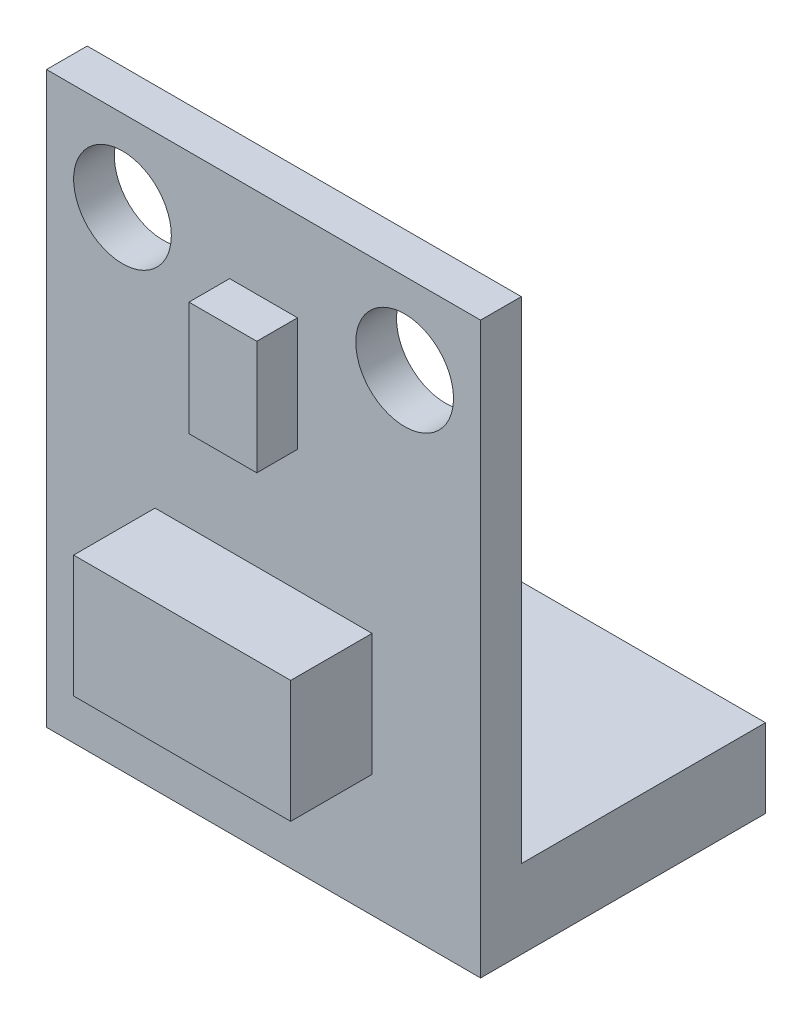
ISO-10303-21;
HEADER;
FILE_DESCRIPTION(('STEP AP214'),'2;1');
FILE_NAME('part.step','',(''),(''),'','','');
FILE_SCHEMA(('AUTOMOTIVE_DESIGN { 1 0 10303 214 1 1 1 1 }'));
ENDSEC;
DATA;
#1=APPLICATION_CONTEXT('core data for automotive mechanical design processes');
#2=APPLICATION_PROTOCOL_DEFINITION('international standard','automotive_design',2000,#1);
#3=PRODUCT_CONTEXT('',#1,'mechanical');
#4=PRODUCT('Part','Part','',(#3));
#5=PRODUCT_RELATED_PRODUCT_CATEGORY('part','',(#4));
#6=PRODUCT_DEFINITION_FORMATION('','',#4);
#7=PRODUCT_DEFINITION_CONTEXT('part definition',#1,'design');
#8=PRODUCT_DEFINITION('design','',#6,#7);
#9=PRODUCT_DEFINITION_SHAPE('','',#8);
#10=(LENGTH_UNIT() NAMED_UNIT(*) SI_UNIT(.MILLI.,.METRE.));
#11=(NAMED_UNIT(*) PLANE_ANGLE_UNIT() SI_UNIT($,.RADIAN.));
#12=(NAMED_UNIT(*) SI_UNIT($,.STERADIAN.) SOLID_ANGLE_UNIT());
#13=UNCERTAINTY_MEASURE_WITH_UNIT(LENGTH_MEASURE(1.E-05),#10,'distance_accuracy_value','');
#14=(GEOMETRIC_REPRESENTATION_CONTEXT(3) GLOBAL_UNCERTAINTY_ASSIGNED_CONTEXT((#13)) GLOBAL_UNIT_ASSIGNED_CONTEXT((#10,
#11,#12)) REPRESENTATION_CONTEXT('',''));
#15=CARTESIAN_POINT('',(0.,0.,0.));
#16=DIRECTION('',(0.,0.,1.));
#17=DIRECTION('',(1.,0.,0.));
#18=AXIS2_PLACEMENT_3D('',#15,#16,#17);
#19=CARTESIAN_POINT('',(0.,0.,0.));
#20=DIRECTION('',(0.,0.,1.));
#21=DIRECTION('',(1.,0.,0.));
#22=AXIS2_PLACEMENT_3D('',#19,#20,#21);
#23=PLANE('',#22);
#24=CARTESIAN_POINT('',(5.2,7.5,0.));
#25=DIRECTION('',(0.,0.,1.));
#26=DIRECTION('',(-1.,0.,0.));
#27=AXIS2_PLACEMENT_3D('',#24,#25,#26);
#28=CIRCLE('',#27,1.8);
#29=CARTESIAN_POINT('',(3.4,7.5,0.));
#30=VERTEX_POINT('',#29);
#31=EDGE_CURVE('E240',#30,#30,#28,.T.);
#32=ORIENTED_EDGE('',*,*,#31,.T.);
#33=EDGE_LOOP('',(#32));
#34=FACE_BOUND('',#33,.T.);
#35=CARTESIAN_POINT('',(-5.2,7.5,0.));
#36=DIRECTION('',(0.,0.,1.));
#37=DIRECTION('',(1.,0.,0.));
#38=AXIS2_PLACEMENT_3D('',#35,#36,#37);
#39=CIRCLE('',#38,1.8);
#40=CARTESIAN_POINT('',(-3.4,7.5,0.));
#41=VERTEX_POINT('',#40);
#42=EDGE_CURVE('E244',#41,#41,#39,.T.);
#43=ORIENTED_EDGE('',*,*,#42,.T.);
#44=EDGE_LOOP('',(#43));
#45=FACE_BOUND('',#44,.T.);
#46=DIRECTION('',(1.,0.,0.));
#47=VECTOR('',#46,1.);
#48=CARTESIAN_POINT('',(8.,-7.6,0.));
#49=LINE('',#48,#47);
#50=CARTESIAN_POINT('',(-8.,-7.6,0.));
#51=VERTEX_POINT('',#50);
#52=CARTESIAN_POINT('',(8.,-7.6,0.));
#53=VERTEX_POINT('',#52);
#54=EDGE_CURVE('E60',#51,#53,#49,.T.);
#55=ORIENTED_EDGE('',*,*,#54,.F.);
#56=DIRECTION('',(0.,-1.,0.));
#57=VECTOR('',#56,1.);
#58=CARTESIAN_POINT('',(-8.,10.5,0.));
#59=LINE('',#58,#57);
#60=CARTESIAN_POINT('',(-8.,10.5,0.));
#61=VERTEX_POINT('',#60);
#62=EDGE_CURVE('E255',#61,#51,#59,.T.);
#63=ORIENTED_EDGE('',*,*,#62,.F.);
#64=DIRECTION('',(-1.,0.,0.));
#65=VECTOR('',#64,1.);
#66=CARTESIAN_POINT('',(-8.,10.5,0.));
#67=LINE('',#66,#65);
#68=CARTESIAN_POINT('',(8.,10.5,0.));
#69=VERTEX_POINT('',#68);
#70=EDGE_CURVE('E261',#69,#61,#67,.T.);
#71=ORIENTED_EDGE('',*,*,#70,.F.);
#72=DIRECTION('',(0.,1.,0.));
#73=VECTOR('',#72,1.);
#74=CARTESIAN_POINT('',(8.,10.5,0.));
#75=LINE('',#74,#73);
#76=EDGE_CURVE('E250',#53,#69,#75,.T.);
#77=ORIENTED_EDGE('',*,*,#76,.F.);
#78=EDGE_LOOP('',(#55,#63,#71,#77));
#79=FACE_BOUND('',#78,.T.);
#80=ADVANCED_FACE('F45',(#34,#45,#79),#23,.F.);
#81=CARTESIAN_POINT('',(0.,0.,1.5));
#82=DIRECTION('',(0.,0.,1.));
#83=DIRECTION('',(1.,0.,0.));
#84=AXIS2_PLACEMENT_3D('',#81,#82,#83);
#85=PLANE('',#84);
#86=CARTESIAN_POINT('',(-5.2,7.5,1.5));
#87=DIRECTION('',(0.,0.,1.));
#88=DIRECTION('',(1.,0.,0.));
#89=AXIS2_PLACEMENT_3D('',#86,#87,#88);
#90=CIRCLE('',#89,1.8);
#91=CARTESIAN_POINT('',(-3.4,7.5,1.5));
#92=VERTEX_POINT('',#91);
#93=EDGE_CURVE('E247',#92,#92,#90,.T.);
#94=ORIENTED_EDGE('',*,*,#93,.F.);
#95=EDGE_LOOP('',(#94));
#96=FACE_BOUND('',#95,.T.);
#97=DIRECTION('',(0.,1.,0.));
#98=VECTOR('',#97,1.);
#99=CARTESIAN_POINT('',(8.,10.5,1.5));
#100=LINE('',#99,#98);
#101=CARTESIAN_POINT('',(8.,-10.5,1.5));
#102=VERTEX_POINT('',#101);
#103=CARTESIAN_POINT('',(8.,10.5,1.5));
#104=VERTEX_POINT('',#103);
#105=EDGE_CURVE('E156',#102,#104,#100,.T.);
#106=ORIENTED_EDGE('',*,*,#105,.T.);
#107=DIRECTION('',(-1.,0.,0.));
#108=VECTOR('',#107,1.);
#109=CARTESIAN_POINT('',(-8.,10.5,1.5));
#110=LINE('',#109,#108);
#111=CARTESIAN_POINT('',(-8.,10.5,1.5));
#112=VERTEX_POINT('',#111);
#113=EDGE_CURVE('E254',#104,#112,#110,.T.);
#114=ORIENTED_EDGE('',*,*,#113,.T.);
#115=DIRECTION('',(0.,-1.,0.));
#116=VECTOR('',#115,1.);
#117=CARTESIAN_POINT('',(-8.,10.5,1.5));
#118=LINE('',#117,#116);
#119=CARTESIAN_POINT('',(-8.,-10.5,1.5));
#120=VERTEX_POINT('',#119);
#121=EDGE_CURVE('E257',#112,#120,#118,.T.);
#122=ORIENTED_EDGE('',*,*,#121,.T.);
#123=DIRECTION('',(1.,0.,0.));
#124=VECTOR('',#123,1.);
#125=CARTESIAN_POINT('',(-8.,-10.5,1.5));
#126=LINE('',#125,#124);
#127=EDGE_CURVE('E160',#120,#102,#126,.T.);
#128=ORIENTED_EDGE('',*,*,#127,.T.);
#129=EDGE_LOOP('',(#106,#114,#122,#128));
#130=FACE_BOUND('',#129,.T.);
#131=CARTESIAN_POINT('',(5.2,7.5,1.5));
#132=DIRECTION('',(0.,0.,1.));
#133=DIRECTION('',(-1.,0.,0.));
#134=AXIS2_PLACEMENT_3D('',#131,#132,#133);
#135=CIRCLE('',#134,1.8);
#136=CARTESIAN_POINT('',(3.4,7.5,1.5));
#137=VERTEX_POINT('',#136);
#138=EDGE_CURVE('E241',#137,#137,#135,.T.);
#139=ORIENTED_EDGE('',*,*,#138,.F.);
#140=EDGE_LOOP('',(#139));
#141=FACE_BOUND('',#140,.T.);
#142=DIRECTION('',(-1.,0.,0.));
#143=VECTOR('',#142,1.);
#144=CARTESIAN_POINT('',(-1.25,7.2,1.5));
#145=LINE('',#144,#143);
#146=CARTESIAN_POINT('',(1.25,7.2,1.5));
#147=VERTEX_POINT('',#146);
#148=CARTESIAN_POINT('',(-1.25,7.2,1.5));
#149=VERTEX_POINT('',#148);
#150=EDGE_CURVE('E225',#147,#149,#145,.T.);
#151=ORIENTED_EDGE('',*,*,#150,.F.);
#152=DIRECTION('',(0.,1.,0.));
#153=VECTOR('',#152,1.);
#154=CARTESIAN_POINT('',(1.25,7.2,1.5));
#155=LINE('',#154,#153);
#156=CARTESIAN_POINT('',(1.25,3.,1.5));
#157=VERTEX_POINT('',#156);
#158=EDGE_CURVE('E211',#157,#147,#155,.T.);
#159=ORIENTED_EDGE('',*,*,#158,.F.);
#160=DIRECTION('',(1.,0.,0.));
#161=VECTOR('',#160,1.);
#162=CARTESIAN_POINT('',(-1.25,3.,1.5));
#163=LINE('',#162,#161);
#164=CARTESIAN_POINT('',(-1.25,3.,1.5));
#165=VERTEX_POINT('',#164);
#166=EDGE_CURVE('E216',#165,#157,#163,.T.);
#167=ORIENTED_EDGE('',*,*,#166,.F.);
#168=DIRECTION('',(0.,-1.,0.));
#169=VECTOR('',#168,1.);
#170=CARTESIAN_POINT('',(-1.25,7.2,1.5));
#171=LINE('',#170,#169);
#172=EDGE_CURVE('E227',#149,#165,#171,.T.);
#173=ORIENTED_EDGE('',*,*,#172,.F.);
#174=EDGE_LOOP('',(#151,#159,#167,#173));
#175=FACE_BOUND('',#174,.T.);
#176=DIRECTION('',(-1.,0.,0.));
#177=VECTOR('',#176,1.);
#178=CARTESIAN_POINT('',(-4.,-1.5,1.5));
#179=LINE('',#178,#177);
#180=CARTESIAN_POINT('',(4.,-1.5,1.5));
#181=VERTEX_POINT('',#180);
#182=CARTESIAN_POINT('',(-4.,-1.5,1.5));
#183=VERTEX_POINT('',#182);
#184=EDGE_CURVE('E198',#181,#183,#179,.T.);
#185=ORIENTED_EDGE('',*,*,#184,.F.);
#186=DIRECTION('',(0.,1.,0.));
#187=VECTOR('',#186,1.);
#188=CARTESIAN_POINT('',(4.,-1.5,1.5));
#189=LINE('',#188,#187);
#190=CARTESIAN_POINT('',(4.,-6.,1.5));
#191=VERTEX_POINT('',#190);
#192=EDGE_CURVE('E184',#191,#181,#189,.T.);
#193=ORIENTED_EDGE('',*,*,#192,.F.);
#194=DIRECTION('',(1.,0.,0.));
#195=VECTOR('',#194,1.);
#196=CARTESIAN_POINT('',(-4.,-6.,1.5));
#197=LINE('',#196,#195);
#198=CARTESIAN_POINT('',(-4.,-6.,1.5));
#199=VERTEX_POINT('',#198);
#200=EDGE_CURVE('E189',#199,#191,#197,.T.);
#201=ORIENTED_EDGE('',*,*,#200,.F.);
#202=DIRECTION('',(0.,-1.,0.));
#203=VECTOR('',#202,1.);
#204=CARTESIAN_POINT('',(-4.,-1.5,1.5));
#205=LINE('',#204,#203);
#206=EDGE_CURVE('E200',#183,#199,#205,.T.);
#207=ORIENTED_EDGE('',*,*,#206,.F.);
#208=EDGE_LOOP('',(#185,#193,#201,#207));
#209=FACE_BOUND('',#208,.T.);
#210=ADVANCED_FACE('F276',(#96,#130,#141,#175,#209),#85,.T.);
#211=CARTESIAN_POINT('',(8.,10.5,1.5));
#212=DIRECTION('',(-1.,0.,0.));
#213=DIRECTION('',(0.,-1.,0.));
#214=AXIS2_PLACEMENT_3D('',#211,#212,#213);
#215=PLANE('',#214);
#216=DIRECTION('',(0.,0.,-1.));
#217=VECTOR('',#216,1.);
#218=CARTESIAN_POINT('',(8.,-10.5,1.5));
#219=LINE('',#218,#217);
#220=CARTESIAN_POINT('',(8.,-10.5,-9.));
#221=VERTEX_POINT('',#220);
#222=EDGE_CURVE('E149',#102,#221,#219,.T.);
#223=ORIENTED_EDGE('',*,*,#222,.T.);
#224=DIRECTION('',(0.,-1.,0.));
#225=VECTOR('',#224,1.);
#226=CARTESIAN_POINT('',(8.,-10.5,-9.));
#227=LINE('',#226,#225);
#228=CARTESIAN_POINT('',(8.,-7.6,-9.));
#229=VERTEX_POINT('',#228);
#230=EDGE_CURVE('E153',#229,#221,#227,.T.);
#231=ORIENTED_EDGE('',*,*,#230,.F.);
#232=DIRECTION('',(0.,0.,1.));
#233=VECTOR('',#232,1.);
#234=CARTESIAN_POINT('',(8.,-7.6,-9.));
#235=LINE('',#234,#233);
#236=EDGE_CURVE('E178',#229,#53,#235,.T.);
#237=ORIENTED_EDGE('',*,*,#236,.T.);
#238=ORIENTED_EDGE('',*,*,#76,.T.);
#239=DIRECTION('',(0.,0.,-1.));
#240=VECTOR('',#239,1.);
#241=CARTESIAN_POINT('',(8.,10.5,1.5));
#242=LINE('',#241,#240);
#243=EDGE_CURVE('E13',#104,#69,#242,.T.);
#244=ORIENTED_EDGE('',*,*,#243,.F.);
#245=ORIENTED_EDGE('',*,*,#105,.F.);
#246=EDGE_LOOP('',(#223,#231,#237,#238,#244,#245));
#247=FACE_BOUND('',#246,.T.);
#248=ADVANCED_FACE('F47',(#247),#215,.F.);
#249=CARTESIAN_POINT('',(-8.,10.5,1.5));
#250=DIRECTION('',(0.,-1.,0.));
#251=DIRECTION('',(0.,0.,-1.));
#252=AXIS2_PLACEMENT_3D('',#249,#250,#251);
#253=PLANE('',#252);
#254=ORIENTED_EDGE('',*,*,#70,.T.);
#255=DIRECTION('',(0.,0.,-1.));
#256=VECTOR('',#255,1.);
#257=CARTESIAN_POINT('',(-8.,10.5,1.5));
#258=LINE('',#257,#256);
#259=EDGE_CURVE('E53',#112,#61,#258,.T.);
#260=ORIENTED_EDGE('',*,*,#259,.F.);
#261=ORIENTED_EDGE('',*,*,#113,.F.);
#262=ORIENTED_EDGE('',*,*,#243,.T.);
#263=EDGE_LOOP('',(#254,#260,#261,#262));
#264=FACE_BOUND('',#263,.T.);
#265=ADVANCED_FACE('F272',(#264),#253,.F.);
#266=CARTESIAN_POINT('',(-8.,10.5,1.5));
#267=DIRECTION('',(1.,0.,0.));
#268=DIRECTION('',(0.,1.,0.));
#269=AXIS2_PLACEMENT_3D('',#266,#267,#268);
#270=PLANE('',#269);
#271=ORIENTED_EDGE('',*,*,#62,.T.);
#272=DIRECTION('',(0.,0.,1.));
#273=VECTOR('',#272,1.);
#274=CARTESIAN_POINT('',(-8.,-7.6,-9.));
#275=LINE('',#274,#273);
#276=CARTESIAN_POINT('',(-8.,-7.6,-9.));
#277=VERTEX_POINT('',#276);
#278=EDGE_CURVE('E181',#277,#51,#275,.T.);
#279=ORIENTED_EDGE('',*,*,#278,.F.);
#280=DIRECTION('',(0.,1.,0.));
#281=VECTOR('',#280,1.);
#282=CARTESIAN_POINT('',(-8.,-10.5,-9.));
#283=LINE('',#282,#281);
#284=CARTESIAN_POINT('',(-8.,-10.5,-9.));
#285=VERTEX_POINT('',#284);
#286=EDGE_CURVE('E168',#285,#277,#283,.T.);
#287=ORIENTED_EDGE('',*,*,#286,.F.);
#288=DIRECTION('',(0.,0.,-1.));
#289=VECTOR('',#288,1.);
#290=CARTESIAN_POINT('',(-8.,-10.5,1.5));
#291=LINE('',#290,#289);
#292=EDGE_CURVE('E159',#120,#285,#291,.T.);
#293=ORIENTED_EDGE('',*,*,#292,.F.);
#294=ORIENTED_EDGE('',*,*,#121,.F.);
#295=ORIENTED_EDGE('',*,*,#259,.T.);
#296=EDGE_LOOP('',(#271,#279,#287,#293,#294,#295));
#297=FACE_BOUND('',#296,.T.);
#298=ADVANCED_FACE('F268',(#297),#270,.F.);
#299=CARTESIAN_POINT('',(-8.,-10.5,1.5));
#300=DIRECTION('',(0.,1.,0.));
#301=DIRECTION('',(0.,0.,1.));
#302=AXIS2_PLACEMENT_3D('',#299,#300,#301);
#303=PLANE('',#302);
#304=ORIENTED_EDGE('',*,*,#292,.T.);
#305=DIRECTION('',(-1.,0.,0.));
#306=VECTOR('',#305,1.);
#307=CARTESIAN_POINT('',(8.,-10.5,-9.));
#308=LINE('',#307,#306);
#309=EDGE_CURVE('E163',#221,#285,#308,.T.);
#310=ORIENTED_EDGE('',*,*,#309,.F.);
#311=ORIENTED_EDGE('',*,*,#222,.F.);
#312=ORIENTED_EDGE('',*,*,#127,.F.);
#313=EDGE_LOOP('',(#304,#310,#311,#312));
#314=FACE_BOUND('',#313,.T.);
#315=ADVANCED_FACE('F164',(#314),#303,.F.);
#316=CARTESIAN_POINT('',(-5.2,7.5,1.5));
#317=DIRECTION('',(0.,0.,-1.));
#318=DIRECTION('',(-1.,0.,0.));
#319=AXIS2_PLACEMENT_3D('',#316,#317,#318);
#320=CYLINDRICAL_SURFACE('',#319,1.8);
#321=ORIENTED_EDGE('',*,*,#93,.T.);
#322=EDGE_LOOP('',(#321));
#323=FACE_BOUND('',#322,.T.);
#324=ORIENTED_EDGE('',*,*,#42,.F.);
#325=EDGE_LOOP('',(#324));
#326=FACE_BOUND('',#325,.T.);
#327=ADVANCED_FACE('F325',(#323,#326),#320,.F.);
#328=CARTESIAN_POINT('',(5.2,7.5,1.5));
#329=DIRECTION('',(0.,0.,-1.));
#330=DIRECTION('',(-1.,0.,0.));
#331=AXIS2_PLACEMENT_3D('',#328,#329,#330);
#332=CYLINDRICAL_SURFACE('',#331,1.8);
#333=ORIENTED_EDGE('',*,*,#138,.T.);
#334=EDGE_LOOP('',(#333));
#335=FACE_BOUND('',#334,.T.);
#336=ORIENTED_EDGE('',*,*,#31,.F.);
#337=EDGE_LOOP('',(#336));
#338=FACE_BOUND('',#337,.T.);
#339=ADVANCED_FACE('F455',(#335,#338),#332,.F.);
#340=CARTESIAN_POINT('',(1.25,7.2,3.));
#341=DIRECTION('',(-1.,0.,0.));
#342=DIRECTION('',(0.,-1.,0.));
#343=AXIS2_PLACEMENT_3D('',#340,#341,#342);
#344=PLANE('',#343);
#345=ORIENTED_EDGE('',*,*,#158,.T.);
#346=DIRECTION('',(0.,0.,-1.));
#347=VECTOR('',#346,1.);
#348=CARTESIAN_POINT('',(1.25,7.2,3.));
#349=LINE('',#348,#347);
#350=CARTESIAN_POINT('',(1.25,7.2,3.));
#351=VERTEX_POINT('',#350);
#352=EDGE_CURVE('E238',#351,#147,#349,.T.);
#353=ORIENTED_EDGE('',*,*,#352,.F.);
#354=DIRECTION('',(0.,1.,0.));
#355=VECTOR('',#354,1.);
#356=CARTESIAN_POINT('',(1.25,7.2,3.));
#357=LINE('',#356,#355);
#358=CARTESIAN_POINT('',(1.25,3.,3.));
#359=VERTEX_POINT('',#358);
#360=EDGE_CURVE('E212',#359,#351,#357,.T.);
#361=ORIENTED_EDGE('',*,*,#360,.F.);
#362=DIRECTION('',(0.,0.,-1.));
#363=VECTOR('',#362,1.);
#364=CARTESIAN_POINT('',(1.25,3.,3.));
#365=LINE('',#364,#363);
#366=EDGE_CURVE('E222',#359,#157,#365,.T.);
#367=ORIENTED_EDGE('',*,*,#366,.T.);
#368=EDGE_LOOP('',(#345,#353,#361,#367));
#369=FACE_BOUND('',#368,.T.);
#370=ADVANCED_FACE('F446',(#369),#344,.F.);
#371=CARTESIAN_POINT('',(-1.25,7.2,3.));
#372=DIRECTION('',(0.,-1.,0.));
#373=DIRECTION('',(0.,0.,-1.));
#374=AXIS2_PLACEMENT_3D('',#371,#372,#373);
#375=PLANE('',#374);
#376=ORIENTED_EDGE('',*,*,#150,.T.);
#377=DIRECTION('',(0.,0.,-1.));
#378=VECTOR('',#377,1.);
#379=CARTESIAN_POINT('',(-1.25,7.2,3.));
#380=LINE('',#379,#378);
#381=CARTESIAN_POINT('',(-1.25,7.2,3.));
#382=VERTEX_POINT('',#381);
#383=EDGE_CURVE('E235',#382,#149,#380,.T.);
#384=ORIENTED_EDGE('',*,*,#383,.F.);
#385=DIRECTION('',(-1.,0.,0.));
#386=VECTOR('',#385,1.);
#387=CARTESIAN_POINT('',(-1.25,7.2,3.));
#388=LINE('',#387,#386);
#389=EDGE_CURVE('E215',#351,#382,#388,.T.);
#390=ORIENTED_EDGE('',*,*,#389,.F.);
#391=ORIENTED_EDGE('',*,*,#352,.T.);
#392=EDGE_LOOP('',(#376,#384,#390,#391));
#393=FACE_BOUND('',#392,.T.);
#394=ADVANCED_FACE('F437',(#393),#375,.F.);
#395=CARTESIAN_POINT('',(-1.25,7.2,3.));
#396=DIRECTION('',(1.,0.,0.));
#397=DIRECTION('',(0.,1.,0.));
#398=AXIS2_PLACEMENT_3D('',#395,#396,#397);
#399=PLANE('',#398);
#400=ORIENTED_EDGE('',*,*,#172,.T.);
#401=DIRECTION('',(0.,0.,-1.));
#402=VECTOR('',#401,1.);
#403=CARTESIAN_POINT('',(-1.25,3.,3.));
#404=LINE('',#403,#402);
#405=CARTESIAN_POINT('',(-1.25,3.,3.));
#406=VERTEX_POINT('',#405);
#407=EDGE_CURVE('E233',#406,#165,#404,.T.);
#408=ORIENTED_EDGE('',*,*,#407,.F.);
#409=DIRECTION('',(0.,-1.,0.));
#410=VECTOR('',#409,1.);
#411=CARTESIAN_POINT('',(-1.25,7.2,3.));
#412=LINE('',#411,#410);
#413=EDGE_CURVE('E218',#382,#406,#412,.T.);
#414=ORIENTED_EDGE('',*,*,#413,.F.);
#415=ORIENTED_EDGE('',*,*,#383,.T.);
#416=EDGE_LOOP('',(#400,#408,#414,#415));
#417=FACE_BOUND('',#416,.T.);
#418=ADVANCED_FACE('F428',(#417),#399,.F.);
#419=CARTESIAN_POINT('',(-1.25,3.,3.));
#420=DIRECTION('',(0.,1.,0.));
#421=DIRECTION('',(0.,0.,1.));
#422=AXIS2_PLACEMENT_3D('',#419,#420,#421);
#423=PLANE('',#422);
#424=ORIENTED_EDGE('',*,*,#166,.T.);
#425=ORIENTED_EDGE('',*,*,#366,.F.);
#426=DIRECTION('',(1.,0.,0.));
#427=VECTOR('',#426,1.);
#428=CARTESIAN_POINT('',(-1.25,3.,3.));
#429=LINE('',#428,#427);
#430=EDGE_CURVE('E220',#406,#359,#429,.T.);
#431=ORIENTED_EDGE('',*,*,#430,.F.);
#432=ORIENTED_EDGE('',*,*,#407,.T.);
#433=EDGE_LOOP('',(#424,#425,#431,#432));
#434=FACE_BOUND('',#433,.T.);
#435=ADVANCED_FACE('F419',(#434),#423,.F.);
#436=CARTESIAN_POINT('',(0.,0.,3.));
#437=DIRECTION('',(0.,0.,1.));
#438=DIRECTION('',(1.,0.,0.));
#439=AXIS2_PLACEMENT_3D('',#436,#437,#438);
#440=PLANE('',#439);
#441=ORIENTED_EDGE('',*,*,#360,.T.);
#442=ORIENTED_EDGE('',*,*,#389,.T.);
#443=ORIENTED_EDGE('',*,*,#413,.T.);
#444=ORIENTED_EDGE('',*,*,#430,.T.);
#445=EDGE_LOOP('',(#441,#442,#443,#444));
#446=FACE_BOUND('',#445,.T.);
#447=ADVANCED_FACE('F406',(#446),#440,.T.);
#448=CARTESIAN_POINT('',(4.,-1.5,4.5));
#449=DIRECTION('',(-1.,0.,0.));
#450=DIRECTION('',(0.,-1.,0.));
#451=AXIS2_PLACEMENT_3D('',#448,#449,#450);
#452=PLANE('',#451);
#453=ORIENTED_EDGE('',*,*,#192,.T.);
#454=DIRECTION('',(0.,0.,-1.));
#455=VECTOR('',#454,1.);
#456=CARTESIAN_POINT('',(4.,-1.5,4.5));
#457=LINE('',#456,#455);
#458=CARTESIAN_POINT('',(4.,-1.5,4.5));
#459=VERTEX_POINT('',#458);
#460=EDGE_CURVE('E209',#459,#181,#457,.T.);
#461=ORIENTED_EDGE('',*,*,#460,.F.);
#462=DIRECTION('',(0.,1.,0.));
#463=VECTOR('',#462,1.);
#464=CARTESIAN_POINT('',(4.,-1.5,4.5));
#465=LINE('',#464,#463);
#466=CARTESIAN_POINT('',(4.,-6.,4.5));
#467=VERTEX_POINT('',#466);
#468=EDGE_CURVE('E185',#467,#459,#465,.T.);
#469=ORIENTED_EDGE('',*,*,#468,.F.);
#470=DIRECTION('',(0.,0.,-1.));
#471=VECTOR('',#470,1.);
#472=CARTESIAN_POINT('',(4.,-6.,4.5));
#473=LINE('',#472,#471);
#474=EDGE_CURVE('E195',#467,#191,#473,.T.);
#475=ORIENTED_EDGE('',*,*,#474,.T.);
#476=EDGE_LOOP('',(#453,#461,#469,#475));
#477=FACE_BOUND('',#476,.T.);
#478=ADVANCED_FACE('F303',(#477),#452,.F.);
#479=CARTESIAN_POINT('',(-4.,-1.5,4.5));
#480=DIRECTION('',(0.,-1.,0.));
#481=DIRECTION('',(0.,0.,-1.));
#482=AXIS2_PLACEMENT_3D('',#479,#480,#481);
#483=PLANE('',#482);
#484=ORIENTED_EDGE('',*,*,#184,.T.);
#485=DIRECTION('',(0.,0.,-1.));
#486=VECTOR('',#485,1.);
#487=CARTESIAN_POINT('',(-4.,-1.5,4.5));
#488=LINE('',#487,#486);
#489=CARTESIAN_POINT('',(-4.,-1.5,4.5));
#490=VERTEX_POINT('',#489);
#491=EDGE_CURVE('E206',#490,#183,#488,.T.);
#492=ORIENTED_EDGE('',*,*,#491,.F.);
#493=DIRECTION('',(-1.,0.,0.));
#494=VECTOR('',#493,1.);
#495=CARTESIAN_POINT('',(-4.,-1.5,4.5));
#496=LINE('',#495,#494);
#497=EDGE_CURVE('E188',#459,#490,#496,.T.);
#498=ORIENTED_EDGE('',*,*,#497,.F.);
#499=ORIENTED_EDGE('',*,*,#460,.T.);
#500=EDGE_LOOP('',(#484,#492,#498,#499));
#501=FACE_BOUND('',#500,.T.);
#502=ADVANCED_FACE('F293',(#501),#483,.F.);
#503=CARTESIAN_POINT('',(-4.,-1.5,4.5));
#504=DIRECTION('',(1.,0.,0.));
#505=DIRECTION('',(0.,1.,0.));
#506=AXIS2_PLACEMENT_3D('',#503,#504,#505);
#507=PLANE('',#506);
#508=ORIENTED_EDGE('',*,*,#206,.T.);
#509=DIRECTION('',(0.,0.,-1.));
#510=VECTOR('',#509,1.);
#511=CARTESIAN_POINT('',(-4.,-6.,4.5));
#512=LINE('',#511,#510);
#513=CARTESIAN_POINT('',(-4.,-6.,4.5));
#514=VERTEX_POINT('',#513);
#515=EDGE_CURVE('E68',#514,#199,#512,.T.);
#516=ORIENTED_EDGE('',*,*,#515,.F.);
#517=DIRECTION('',(0.,-1.,0.));
#518=VECTOR('',#517,1.);
#519=CARTESIAN_POINT('',(-4.,-1.5,4.5));
#520=LINE('',#519,#518);
#521=EDGE_CURVE('E191',#490,#514,#520,.T.);
#522=ORIENTED_EDGE('',*,*,#521,.F.);
#523=ORIENTED_EDGE('',*,*,#491,.T.);
#524=EDGE_LOOP('',(#508,#516,#522,#523));
#525=FACE_BOUND('',#524,.T.);
#526=ADVANCED_FACE('F297',(#525),#507,.F.);
#527=CARTESIAN_POINT('',(-4.,-6.,4.5));
#528=DIRECTION('',(0.,1.,0.));
#529=DIRECTION('',(0.,0.,1.));
#530=AXIS2_PLACEMENT_3D('',#527,#528,#529);
#531=PLANE('',#530);
#532=ORIENTED_EDGE('',*,*,#200,.T.);
#533=ORIENTED_EDGE('',*,*,#474,.F.);
#534=DIRECTION('',(1.,0.,0.));
#535=VECTOR('',#534,1.);
#536=CARTESIAN_POINT('',(-4.,-6.,4.5));
#537=LINE('',#536,#535);
#538=EDGE_CURVE('E193',#514,#467,#537,.T.);
#539=ORIENTED_EDGE('',*,*,#538,.F.);
#540=ORIENTED_EDGE('',*,*,#515,.T.);
#541=EDGE_LOOP('',(#532,#533,#539,#540));
#542=FACE_BOUND('',#541,.T.);
#543=ADVANCED_FACE('F304',(#542),#531,.F.);
#544=CARTESIAN_POINT('',(0.,0.,4.5));
#545=DIRECTION('',(0.,0.,1.));
#546=DIRECTION('',(1.,0.,0.));
#547=AXIS2_PLACEMENT_3D('',#544,#545,#546);
#548=PLANE('',#547);
#549=ORIENTED_EDGE('',*,*,#468,.T.);
#550=ORIENTED_EDGE('',*,*,#497,.T.);
#551=ORIENTED_EDGE('',*,*,#521,.T.);
#552=ORIENTED_EDGE('',*,*,#538,.T.);
#553=EDGE_LOOP('',(#549,#550,#551,#552));
#554=FACE_BOUND('',#553,.T.);
#555=ADVANCED_FACE('F299',(#554),#548,.T.);
#556=CARTESIAN_POINT('',(8.,-7.6,-9.));
#557=DIRECTION('',(0.,-1.,0.));
#558=DIRECTION('',(0.,0.,-1.));
#559=AXIS2_PLACEMENT_3D('',#556,#557,#558);
#560=PLANE('',#559);
#561=ORIENTED_EDGE('',*,*,#54,.T.);
#562=ORIENTED_EDGE('',*,*,#236,.F.);
#563=DIRECTION('',(1.,0.,0.));
#564=VECTOR('',#563,1.);
#565=CARTESIAN_POINT('',(8.,-7.6,-9.));
#566=LINE('',#565,#564);
#567=EDGE_CURVE('E172',#277,#229,#566,.T.);
#568=ORIENTED_EDGE('',*,*,#567,.F.);
#569=ORIENTED_EDGE('',*,*,#278,.T.);
#570=EDGE_LOOP('',(#561,#562,#568,#569));
#571=FACE_BOUND('',#570,.T.);
#572=ADVANCED_FACE('F274',(#571),#560,.F.);
#573=CARTESIAN_POINT('',(0.,0.,-9.));
#574=DIRECTION('',(0.,0.,1.));
#575=DIRECTION('',(1.,0.,0.));
#576=AXIS2_PLACEMENT_3D('',#573,#574,#575);
#577=PLANE('',#576);
#578=ORIENTED_EDGE('',*,*,#230,.T.);
#579=ORIENTED_EDGE('',*,*,#309,.T.);
#580=ORIENTED_EDGE('',*,*,#286,.T.);
#581=ORIENTED_EDGE('',*,*,#567,.T.);
#582=EDGE_LOOP('',(#578,#579,#580,#581));
#583=FACE_BOUND('',#582,.T.);
#584=ADVANCED_FACE('F170',(#583),#577,.F.);
#585=CLOSED_SHELL('',(#80,#210,#248,#265,#298,#315,#327,#339,#370,#394,#418,#435,#447,#478,#502,
#526,#543,#555,#572,#584));
#586=MANIFOLD_SOLID_BREP('B2',#585);
#587=ADVANCED_BREP_SHAPE_REPRESENTATION('',(#18,#586),#14);
#588=SHAPE_DEFINITION_REPRESENTATION(#9,#587);
ENDSEC;
END-ISO-10303-21;
